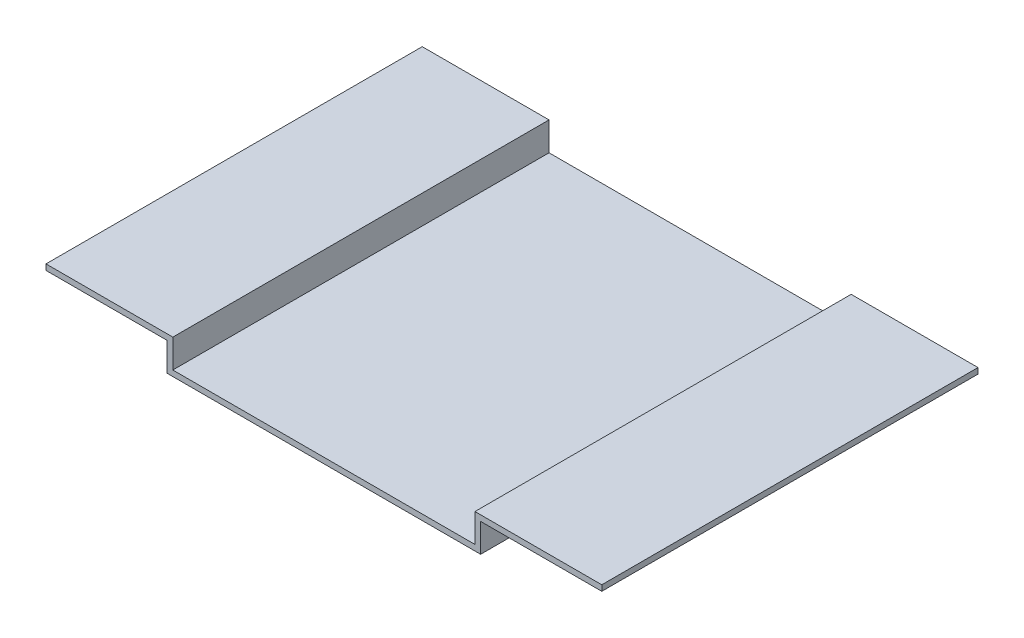
ISO-10303-21;
HEADER;
FILE_DESCRIPTION(('STEP AP214'),'2;1');
FILE_NAME('part.step','',(''),(''),'','','');
FILE_SCHEMA(('AUTOMOTIVE_DESIGN { 1 0 10303 214 1 1 1 1 }'));
ENDSEC;
DATA;
#1=APPLICATION_CONTEXT('core data for automotive mechanical design processes');
#2=APPLICATION_PROTOCOL_DEFINITION('international standard','automotive_design',2000,#1);
#3=PRODUCT_CONTEXT('',#1,'mechanical');
#4=PRODUCT('Part','Part','',(#3));
#5=PRODUCT_RELATED_PRODUCT_CATEGORY('part','',(#4));
#6=PRODUCT_DEFINITION_FORMATION('','',#4);
#7=PRODUCT_DEFINITION_CONTEXT('part definition',#1,'design');
#8=PRODUCT_DEFINITION('design','',#6,#7);
#9=PRODUCT_DEFINITION_SHAPE('','',#8);
#10=(LENGTH_UNIT() NAMED_UNIT(*) SI_UNIT(.MILLI.,.METRE.));
#11=(NAMED_UNIT(*) PLANE_ANGLE_UNIT() SI_UNIT($,.RADIAN.));
#12=(NAMED_UNIT(*) SI_UNIT($,.STERADIAN.) SOLID_ANGLE_UNIT());
#13=UNCERTAINTY_MEASURE_WITH_UNIT(LENGTH_MEASURE(1.E-05),#10,'distance_accuracy_value','');
#14=(GEOMETRIC_REPRESENTATION_CONTEXT(3) GLOBAL_UNCERTAINTY_ASSIGNED_CONTEXT((#13)) GLOBAL_UNIT_ASSIGNED_CONTEXT((#10,
#11,#12)) REPRESENTATION_CONTEXT('',''));
#15=CARTESIAN_POINT('',(0.,0.,0.));
#16=DIRECTION('',(0.,0.,1.));
#17=DIRECTION('',(1.,0.,0.));
#18=AXIS2_PLACEMENT_3D('',#15,#16,#17);
#19=CARTESIAN_POINT('',(-86.5918367346939,-12.3214285714286,132.));
#20=DIRECTION('',(1.,0.,0.));
#21=DIRECTION('',(0.,0.,-1.));
#22=AXIS2_PLACEMENT_3D('',#19,#20,#21);
#23=PLANE('',#22);
#24=DIRECTION('',(0.,-1.,0.));
#25=VECTOR('',#24,1.);
#26=CARTESIAN_POINT('',(-86.5918367346939,-12.3214285714286,0.));
#27=LINE('',#26,#25);
#28=CARTESIAN_POINT('',(-86.5918367346939,-12.3214285714286,0.));
#29=VERTEX_POINT('',#28);
#30=CARTESIAN_POINT('',(-86.5918367346939,-14.3214285714286,0.));
#31=VERTEX_POINT('',#30);
#32=EDGE_CURVE('E163',#29,#31,#27,.T.);
#33=ORIENTED_EDGE('',*,*,#32,.T.);
#34=DIRECTION('',(0.,0.,-1.));
#35=VECTOR('',#34,1.);
#36=CARTESIAN_POINT('',(-86.5918367346939,-14.3214285714286,132.));
#37=LINE('',#36,#35);
#38=CARTESIAN_POINT('',(-86.5918367346939,-14.3214285714286,132.));
#39=VERTEX_POINT('',#38);
#40=EDGE_CURVE('E11',#39,#31,#37,.T.);
#41=ORIENTED_EDGE('',*,*,#40,.F.);
#42=DIRECTION('',(0.,-1.,0.));
#43=VECTOR('',#42,1.);
#44=CARTESIAN_POINT('',(-86.5918367346939,-12.3214285714286,132.));
#45=LINE('',#44,#43);
#46=CARTESIAN_POINT('',(-86.5918367346939,-12.3214285714286,132.));
#47=VERTEX_POINT('',#46);
#48=EDGE_CURVE('E185',#47,#39,#45,.T.);
#49=ORIENTED_EDGE('',*,*,#48,.F.);
#50=DIRECTION('',(0.,0.,-1.));
#51=VECTOR('',#50,1.);
#52=CARTESIAN_POINT('',(-86.5918367346939,-12.3214285714286,132.));
#53=LINE('',#52,#51);
#54=EDGE_CURVE('E159',#47,#29,#53,.T.);
#55=ORIENTED_EDGE('',*,*,#54,.T.);
#56=EDGE_LOOP('',(#33,#41,#49,#55));
#57=FACE_BOUND('',#56,.T.);
#58=ADVANCED_FACE('F43',(#57),#23,.F.);
#59=CARTESIAN_POINT('',(-86.5918367346939,-14.3214285714286,132.));
#60=DIRECTION('',(0.,1.,0.));
#61=DIRECTION('',(0.,0.,1.));
#62=AXIS2_PLACEMENT_3D('',#59,#60,#61);
#63=PLANE('',#62);
#64=DIRECTION('',(1.,0.,0.));
#65=VECTOR('',#64,1.);
#66=CARTESIAN_POINT('',(-86.5918367346939,-14.3214285714286,0.));
#67=LINE('',#66,#65);
#68=CARTESIAN_POINT('',(-44.0918367346939,-14.3214285714286,0.));
#69=VERTEX_POINT('',#68);
#70=EDGE_CURVE('E166',#31,#69,#67,.T.);
#71=ORIENTED_EDGE('',*,*,#70,.T.);
#72=DIRECTION('',(0.,0.,-1.));
#73=VECTOR('',#72,1.);
#74=CARTESIAN_POINT('',(-44.0918367346939,-14.3214285714286,132.));
#75=LINE('',#74,#73);
#76=CARTESIAN_POINT('',(-44.0918367346939,-14.3214285714286,132.));
#77=VERTEX_POINT('',#76);
#78=EDGE_CURVE('E51',#77,#69,#75,.T.);
#79=ORIENTED_EDGE('',*,*,#78,.F.);
#80=DIRECTION('',(1.,0.,0.));
#81=VECTOR('',#80,1.);
#82=CARTESIAN_POINT('',(-86.5918367346939,-14.3214285714286,132.));
#83=LINE('',#82,#81);
#84=EDGE_CURVE('E114',#39,#77,#83,.T.);
#85=ORIENTED_EDGE('',*,*,#84,.F.);
#86=ORIENTED_EDGE('',*,*,#40,.T.);
#87=EDGE_LOOP('',(#71,#79,#85,#86));
#88=FACE_BOUND('',#87,.T.);
#89=ADVANCED_FACE('F263',(#88),#63,.F.);
#90=CARTESIAN_POINT('',(-44.0918367346939,-14.3214285714286,132.));
#91=DIRECTION('',(1.,0.,0.));
#92=DIRECTION('',(0.,1.,0.));
#93=AXIS2_PLACEMENT_3D('',#90,#91,#92);
#94=PLANE('',#93);
#95=DIRECTION('',(0.,-1.,0.));
#96=VECTOR('',#95,1.);
#97=CARTESIAN_POINT('',(-44.0918367346939,-14.3214285714286,0.));
#98=LINE('',#97,#96);
#99=CARTESIAN_POINT('',(-44.0918367346939,-24.3214285714286,0.));
#100=VERTEX_POINT('',#99);
#101=EDGE_CURVE('E168',#69,#100,#98,.T.);
#102=ORIENTED_EDGE('',*,*,#101,.T.);
#103=DIRECTION('',(0.,0.,-1.));
#104=VECTOR('',#103,1.);
#105=CARTESIAN_POINT('',(-44.0918367346939,-24.3214285714286,132.));
#106=LINE('',#105,#104);
#107=CARTESIAN_POINT('',(-44.0918367346939,-24.3214285714286,132.));
#108=VERTEX_POINT('',#107);
#109=EDGE_CURVE('E204',#108,#100,#106,.T.);
#110=ORIENTED_EDGE('',*,*,#109,.F.);
#111=DIRECTION('',(0.,-1.,0.));
#112=VECTOR('',#111,1.);
#113=CARTESIAN_POINT('',(-44.0918367346939,-14.3214285714286,132.));
#114=LINE('',#113,#112);
#115=EDGE_CURVE('E212',#77,#108,#114,.T.);
#116=ORIENTED_EDGE('',*,*,#115,.F.);
#117=ORIENTED_EDGE('',*,*,#78,.T.);
#118=EDGE_LOOP('',(#102,#110,#116,#117));
#119=FACE_BOUND('',#118,.T.);
#120=ADVANCED_FACE('F210',(#119),#94,.F.);
#121=CARTESIAN_POINT('',(-44.0918367346939,-24.3214285714286,132.));
#122=DIRECTION('',(0.,1.,0.));
#123=DIRECTION('',(-1.,0.,0.));
#124=AXIS2_PLACEMENT_3D('',#121,#122,#123);
#125=PLANE('',#124);
#126=DIRECTION('',(1.,0.,0.));
#127=VECTOR('',#126,1.);
#128=CARTESIAN_POINT('',(-44.0918367346939,-24.3214285714286,0.));
#129=LINE('',#128,#127);
#130=CARTESIAN_POINT('',(65.9081632653061,-24.3214285714286,0.));
#131=VERTEX_POINT('',#130);
#132=EDGE_CURVE('E170',#100,#131,#129,.T.);
#133=ORIENTED_EDGE('',*,*,#132,.T.);
#134=DIRECTION('',(0.,0.,-1.));
#135=VECTOR('',#134,1.);
#136=CARTESIAN_POINT('',(65.9081632653061,-24.3214285714286,132.));
#137=LINE('',#136,#135);
#138=CARTESIAN_POINT('',(65.9081632653061,-24.3214285714286,132.));
#139=VERTEX_POINT('',#138);
#140=EDGE_CURVE('E201',#139,#131,#137,.T.);
#141=ORIENTED_EDGE('',*,*,#140,.F.);
#142=DIRECTION('',(1.,0.,0.));
#143=VECTOR('',#142,1.);
#144=CARTESIAN_POINT('',(-44.0918367346939,-24.3214285714286,132.));
#145=LINE('',#144,#143);
#146=EDGE_CURVE('E230',#108,#139,#145,.T.);
#147=ORIENTED_EDGE('',*,*,#146,.F.);
#148=ORIENTED_EDGE('',*,*,#109,.T.);
#149=EDGE_LOOP('',(#133,#141,#147,#148));
#150=FACE_BOUND('',#149,.T.);
#151=ADVANCED_FACE('F221',(#150),#125,.F.);
#152=CARTESIAN_POINT('',(65.9081632653061,-24.3214285714286,132.));
#153=DIRECTION('',(-1.,0.,0.));
#154=DIRECTION('',(0.,0.,1.));
#155=AXIS2_PLACEMENT_3D('',#152,#153,#154);
#156=PLANE('',#155);
#157=DIRECTION('',(0.,1.,0.));
#158=VECTOR('',#157,1.);
#159=CARTESIAN_POINT('',(65.9081632653061,-24.3214285714286,0.));
#160=LINE('',#159,#158);
#161=CARTESIAN_POINT('',(65.9081632653061,-14.3214285714286,0.));
#162=VERTEX_POINT('',#161);
#163=EDGE_CURVE('E172',#131,#162,#160,.T.);
#164=ORIENTED_EDGE('',*,*,#163,.T.);
#165=DIRECTION('',(0.,0.,-1.));
#166=VECTOR('',#165,1.);
#167=CARTESIAN_POINT('',(65.9081632653061,-14.3214285714286,132.));
#168=LINE('',#167,#166);
#169=CARTESIAN_POINT('',(65.9081632653061,-14.3214285714286,132.));
#170=VERTEX_POINT('',#169);
#171=EDGE_CURVE('E198',#170,#162,#168,.T.);
#172=ORIENTED_EDGE('',*,*,#171,.F.);
#173=DIRECTION('',(0.,1.,0.));
#174=VECTOR('',#173,1.);
#175=CARTESIAN_POINT('',(65.9081632653061,-24.3214285714286,132.));
#176=LINE('',#175,#174);
#177=EDGE_CURVE('E227',#139,#170,#176,.T.);
#178=ORIENTED_EDGE('',*,*,#177,.F.);
#179=ORIENTED_EDGE('',*,*,#140,.T.);
#180=EDGE_LOOP('',(#164,#172,#178,#179));
#181=FACE_BOUND('',#180,.T.);
#182=ADVANCED_FACE('F225',(#181),#156,.F.);
#183=CARTESIAN_POINT('',(65.9081632653061,-14.3214285714286,132.));
#184=DIRECTION('',(0.,1.,0.));
#185=DIRECTION('',(0.,0.,1.));
#186=AXIS2_PLACEMENT_3D('',#183,#184,#185);
#187=PLANE('',#186);
#188=DIRECTION('',(1.,0.,0.));
#189=VECTOR('',#188,1.);
#190=CARTESIAN_POINT('',(65.9081632653061,-14.3214285714286,0.));
#191=LINE('',#190,#189);
#192=CARTESIAN_POINT('',(108.408163265306,-14.3214285714286,0.));
#193=VERTEX_POINT('',#192);
#194=EDGE_CURVE('E174',#162,#193,#191,.T.);
#195=ORIENTED_EDGE('',*,*,#194,.T.);
#196=DIRECTION('',(0.,0.,-1.));
#197=VECTOR('',#196,1.);
#198=CARTESIAN_POINT('',(108.408163265306,-14.3214285714286,132.));
#199=LINE('',#198,#197);
#200=CARTESIAN_POINT('',(108.408163265306,-14.3214285714286,132.));
#201=VERTEX_POINT('',#200);
#202=EDGE_CURVE('E195',#201,#193,#199,.T.);
#203=ORIENTED_EDGE('',*,*,#202,.F.);
#204=DIRECTION('',(1.,0.,0.));
#205=VECTOR('',#204,1.);
#206=CARTESIAN_POINT('',(65.9081632653061,-14.3214285714286,132.));
#207=LINE('',#206,#205);
#208=EDGE_CURVE('E229',#170,#201,#207,.T.);
#209=ORIENTED_EDGE('',*,*,#208,.F.);
#210=ORIENTED_EDGE('',*,*,#171,.T.);
#211=EDGE_LOOP('',(#195,#203,#209,#210));
#212=FACE_BOUND('',#211,.T.);
#213=ADVANCED_FACE('F276',(#212),#187,.F.);
#214=CARTESIAN_POINT('',(108.408163265306,-12.3214285714286,132.));
#215=DIRECTION('',(-1.,0.,0.));
#216=DIRECTION('',(0.,0.,1.));
#217=AXIS2_PLACEMENT_3D('',#214,#215,#216);
#218=PLANE('',#217);
#219=DIRECTION('',(0.,1.,0.));
#220=VECTOR('',#219,1.);
#221=CARTESIAN_POINT('',(108.408163265306,-12.3214285714286,0.));
#222=LINE('',#221,#220);
#223=CARTESIAN_POINT('',(108.408163265306,-12.3214285714286,0.));
#224=VERTEX_POINT('',#223);
#225=EDGE_CURVE('E176',#193,#224,#222,.T.);
#226=ORIENTED_EDGE('',*,*,#225,.T.);
#227=DIRECTION('',(0.,0.,-1.));
#228=VECTOR('',#227,1.);
#229=CARTESIAN_POINT('',(108.408163265306,-12.3214285714286,132.));
#230=LINE('',#229,#228);
#231=CARTESIAN_POINT('',(108.408163265306,-12.3214285714286,132.));
#232=VERTEX_POINT('',#231);
#233=EDGE_CURVE('E192',#232,#224,#230,.T.);
#234=ORIENTED_EDGE('',*,*,#233,.F.);
#235=DIRECTION('',(0.,1.,0.));
#236=VECTOR('',#235,1.);
#237=CARTESIAN_POINT('',(108.408163265306,-12.3214285714286,132.));
#238=LINE('',#237,#236);
#239=EDGE_CURVE('E232',#201,#232,#238,.T.);
#240=ORIENTED_EDGE('',*,*,#239,.F.);
#241=ORIENTED_EDGE('',*,*,#202,.T.);
#242=EDGE_LOOP('',(#226,#234,#240,#241));
#243=FACE_BOUND('',#242,.T.);
#244=ADVANCED_FACE('F279',(#243),#218,.F.);
#245=CARTESIAN_POINT('',(63.9081632653061,-12.3214285714286,132.));
#246=DIRECTION('',(0.,-1.,0.));
#247=DIRECTION('',(0.,0.,-1.));
#248=AXIS2_PLACEMENT_3D('',#245,#246,#247);
#249=PLANE('',#248);
#250=DIRECTION('',(-1.,0.,0.));
#251=VECTOR('',#250,1.);
#252=CARTESIAN_POINT('',(63.9081632653061,-12.3214285714286,0.));
#253=LINE('',#252,#251);
#254=CARTESIAN_POINT('',(63.9081632653061,-12.3214285714286,0.));
#255=VERTEX_POINT('',#254);
#256=EDGE_CURVE('E178',#224,#255,#253,.T.);
#257=ORIENTED_EDGE('',*,*,#256,.T.);
#258=DIRECTION('',(0.,0.,-1.));
#259=VECTOR('',#258,1.);
#260=CARTESIAN_POINT('',(63.9081632653061,-12.3214285714286,132.));
#261=LINE('',#260,#259);
#262=CARTESIAN_POINT('',(63.9081632653061,-12.3214285714286,132.));
#263=VERTEX_POINT('',#262);
#264=EDGE_CURVE('E189',#263,#255,#261,.T.);
#265=ORIENTED_EDGE('',*,*,#264,.F.);
#266=DIRECTION('',(-1.,0.,0.));
#267=VECTOR('',#266,1.);
#268=CARTESIAN_POINT('',(63.9081632653061,-12.3214285714286,132.));
#269=LINE('',#268,#267);
#270=EDGE_CURVE('E238',#232,#263,#269,.T.);
#271=ORIENTED_EDGE('',*,*,#270,.F.);
#272=ORIENTED_EDGE('',*,*,#233,.T.);
#273=EDGE_LOOP('',(#257,#265,#271,#272));
#274=FACE_BOUND('',#273,.T.);
#275=ADVANCED_FACE('F244',(#274),#249,.F.);
#276=CARTESIAN_POINT('',(63.9081632653061,-22.3214285714286,132.));
#277=DIRECTION('',(1.,0.,0.));
#278=DIRECTION('',(0.,0.,-1.));
#279=AXIS2_PLACEMENT_3D('',#276,#277,#278);
#280=PLANE('',#279);
#281=DIRECTION('',(0.,-1.,0.));
#282=VECTOR('',#281,1.);
#283=CARTESIAN_POINT('',(63.9081632653061,-22.3214285714286,0.));
#284=LINE('',#283,#282);
#285=CARTESIAN_POINT('',(63.9081632653061,-22.3214285714286,0.));
#286=VERTEX_POINT('',#285);
#287=EDGE_CURVE('E180',#255,#286,#284,.T.);
#288=ORIENTED_EDGE('',*,*,#287,.T.);
#289=DIRECTION('',(0.,0.,-1.));
#290=VECTOR('',#289,1.);
#291=CARTESIAN_POINT('',(63.9081632653061,-22.3214285714286,132.));
#292=LINE('',#291,#290);
#293=CARTESIAN_POINT('',(63.9081632653061,-22.3214285714286,132.));
#294=VERTEX_POINT('',#293);
#295=EDGE_CURVE('E154',#294,#286,#292,.T.);
#296=ORIENTED_EDGE('',*,*,#295,.F.);
#297=DIRECTION('',(0.,-1.,0.));
#298=VECTOR('',#297,1.);
#299=CARTESIAN_POINT('',(63.9081632653061,-22.3214285714286,132.));
#300=LINE('',#299,#298);
#301=EDGE_CURVE('E145',#263,#294,#300,.T.);
#302=ORIENTED_EDGE('',*,*,#301,.F.);
#303=ORIENTED_EDGE('',*,*,#264,.T.);
#304=EDGE_LOOP('',(#288,#296,#302,#303));
#305=FACE_BOUND('',#304,.T.);
#306=ADVANCED_FACE('F248',(#305),#280,.F.);
#307=CARTESIAN_POINT('',(-42.0918367346939,-22.3214285714286,132.));
#308=DIRECTION('',(0.,-1.,0.));
#309=DIRECTION('',(1.,0.,0.));
#310=AXIS2_PLACEMENT_3D('',#307,#308,#309);
#311=PLANE('',#310);
#312=DIRECTION('',(-1.,0.,0.));
#313=VECTOR('',#312,1.);
#314=CARTESIAN_POINT('',(-42.0918367346939,-22.3214285714286,0.));
#315=LINE('',#314,#313);
#316=CARTESIAN_POINT('',(-42.0918367346939,-22.3214285714286,0.));
#317=VERTEX_POINT('',#316);
#318=EDGE_CURVE('E153',#286,#317,#315,.T.);
#319=ORIENTED_EDGE('',*,*,#318,.T.);
#320=DIRECTION('',(0.,0.,-1.));
#321=VECTOR('',#320,1.);
#322=CARTESIAN_POINT('',(-42.0918367346939,-22.3214285714286,132.));
#323=LINE('',#322,#321);
#324=CARTESIAN_POINT('',(-42.0918367346939,-22.3214285714286,132.));
#325=VERTEX_POINT('',#324);
#326=EDGE_CURVE('E150',#325,#317,#323,.T.);
#327=ORIENTED_EDGE('',*,*,#326,.F.);
#328=DIRECTION('',(-1.,0.,0.));
#329=VECTOR('',#328,1.);
#330=CARTESIAN_POINT('',(-42.0918367346939,-22.3214285714286,132.));
#331=LINE('',#330,#329);
#332=EDGE_CURVE('E139',#294,#325,#331,.T.);
#333=ORIENTED_EDGE('',*,*,#332,.F.);
#334=ORIENTED_EDGE('',*,*,#295,.T.);
#335=EDGE_LOOP('',(#319,#327,#333,#334));
#336=FACE_BOUND('',#335,.T.);
#337=ADVANCED_FACE('F151',(#336),#311,.F.);
#338=CARTESIAN_POINT('',(-42.0918367346939,-12.3214285714286,132.));
#339=DIRECTION('',(-1.,0.,0.));
#340=DIRECTION('',(0.,-1.,0.));
#341=AXIS2_PLACEMENT_3D('',#338,#339,#340);
#342=PLANE('',#341);
#343=DIRECTION('',(0.,1.,0.));
#344=VECTOR('',#343,1.);
#345=CARTESIAN_POINT('',(-42.0918367346939,-12.3214285714286,0.));
#346=LINE('',#345,#344);
#347=CARTESIAN_POINT('',(-42.0918367346939,-12.3214285714286,0.));
#348=VERTEX_POINT('',#347);
#349=EDGE_CURVE('E100',#317,#348,#346,.T.);
#350=ORIENTED_EDGE('',*,*,#349,.T.);
#351=DIRECTION('',(0.,0.,-1.));
#352=VECTOR('',#351,1.);
#353=CARTESIAN_POINT('',(-42.0918367346939,-12.3214285714286,132.));
#354=LINE('',#353,#352);
#355=CARTESIAN_POINT('',(-42.0918367346939,-12.3214285714286,132.));
#356=VERTEX_POINT('',#355);
#357=EDGE_CURVE('E155',#356,#348,#354,.T.);
#358=ORIENTED_EDGE('',*,*,#357,.F.);
#359=DIRECTION('',(0.,1.,0.));
#360=VECTOR('',#359,1.);
#361=CARTESIAN_POINT('',(-42.0918367346939,-12.3214285714286,132.));
#362=LINE('',#361,#360);
#363=EDGE_CURVE('E143',#325,#356,#362,.T.);
#364=ORIENTED_EDGE('',*,*,#363,.F.);
#365=ORIENTED_EDGE('',*,*,#326,.T.);
#366=EDGE_LOOP('',(#350,#358,#364,#365));
#367=FACE_BOUND('',#366,.T.);
#368=ADVANCED_FACE('F157',(#367),#342,.F.);
#369=CARTESIAN_POINT('',(-86.5918367346939,-12.3214285714286,132.));
#370=DIRECTION('',(0.,-1.,0.));
#371=DIRECTION('',(0.,0.,-1.));
#372=AXIS2_PLACEMENT_3D('',#369,#370,#371);
#373=PLANE('',#372);
#374=DIRECTION('',(-1.,0.,0.));
#375=VECTOR('',#374,1.);
#376=CARTESIAN_POINT('',(-86.5918367346939,-12.3214285714286,0.));
#377=LINE('',#376,#375);
#378=EDGE_CURVE('E106',#348,#29,#377,.T.);
#379=ORIENTED_EDGE('',*,*,#378,.T.);
#380=ORIENTED_EDGE('',*,*,#54,.F.);
#381=DIRECTION('',(-1.,0.,0.));
#382=VECTOR('',#381,1.);
#383=CARTESIAN_POINT('',(-86.5918367346939,-12.3214285714286,132.));
#384=LINE('',#383,#382);
#385=EDGE_CURVE('E59',#356,#47,#384,.T.);
#386=ORIENTED_EDGE('',*,*,#385,.F.);
#387=ORIENTED_EDGE('',*,*,#357,.T.);
#388=EDGE_LOOP('',(#379,#380,#386,#387));
#389=FACE_BOUND('',#388,.T.);
#390=ADVANCED_FACE('F252',(#389),#373,.F.);
#391=CARTESIAN_POINT('',(0.,0.,132.));
#392=DIRECTION('',(0.,0.,1.));
#393=DIRECTION('',(1.,0.,0.));
#394=AXIS2_PLACEMENT_3D('',#391,#392,#393);
#395=PLANE('',#394);
#396=ORIENTED_EDGE('',*,*,#48,.T.);
#397=ORIENTED_EDGE('',*,*,#84,.T.);
#398=ORIENTED_EDGE('',*,*,#115,.T.);
#399=ORIENTED_EDGE('',*,*,#146,.T.);
#400=ORIENTED_EDGE('',*,*,#177,.T.);
#401=ORIENTED_EDGE('',*,*,#208,.T.);
#402=ORIENTED_EDGE('',*,*,#239,.T.);
#403=ORIENTED_EDGE('',*,*,#270,.T.);
#404=ORIENTED_EDGE('',*,*,#301,.T.);
#405=ORIENTED_EDGE('',*,*,#332,.T.);
#406=ORIENTED_EDGE('',*,*,#363,.T.);
#407=ORIENTED_EDGE('',*,*,#385,.T.);
#408=EDGE_LOOP('',(#396,#397,#398,#399,#400,#401,#402,#403,#404,#405,#406,#407));
#409=FACE_BOUND('',#408,.T.);
#410=ADVANCED_FACE('F141',(#409),#395,.T.);
#411=CARTESIAN_POINT('',(0.,0.,0.));
#412=DIRECTION('',(0.,0.,1.));
#413=DIRECTION('',(1.,0.,0.));
#414=AXIS2_PLACEMENT_3D('',#411,#412,#413);
#415=PLANE('',#414);
#416=ORIENTED_EDGE('',*,*,#32,.F.);
#417=ORIENTED_EDGE('',*,*,#378,.F.);
#418=ORIENTED_EDGE('',*,*,#349,.F.);
#419=ORIENTED_EDGE('',*,*,#318,.F.);
#420=ORIENTED_EDGE('',*,*,#287,.F.);
#421=ORIENTED_EDGE('',*,*,#256,.F.);
#422=ORIENTED_EDGE('',*,*,#225,.F.);
#423=ORIENTED_EDGE('',*,*,#194,.F.);
#424=ORIENTED_EDGE('',*,*,#163,.F.);
#425=ORIENTED_EDGE('',*,*,#132,.F.);
#426=ORIENTED_EDGE('',*,*,#101,.F.);
#427=ORIENTED_EDGE('',*,*,#70,.F.);
#428=EDGE_LOOP('',(#416,#417,#418,#419,#420,#421,#422,#423,#424,#425,#426,#427));
#429=FACE_BOUND('',#428,.T.);
#430=ADVANCED_FACE('F216',(#429),#415,.F.);
#431=CLOSED_SHELL('',(#58,#89,#120,#151,#182,#213,#244,#275,#306,#337,#368,#390,#410,#430));
#432=MANIFOLD_SOLID_BREP('B2',#431);
#433=ADVANCED_BREP_SHAPE_REPRESENTATION('',(#18,#432),#14);
#434=SHAPE_DEFINITION_REPRESENTATION(#9,#433);
ENDSEC;
END-ISO-10303-21;
